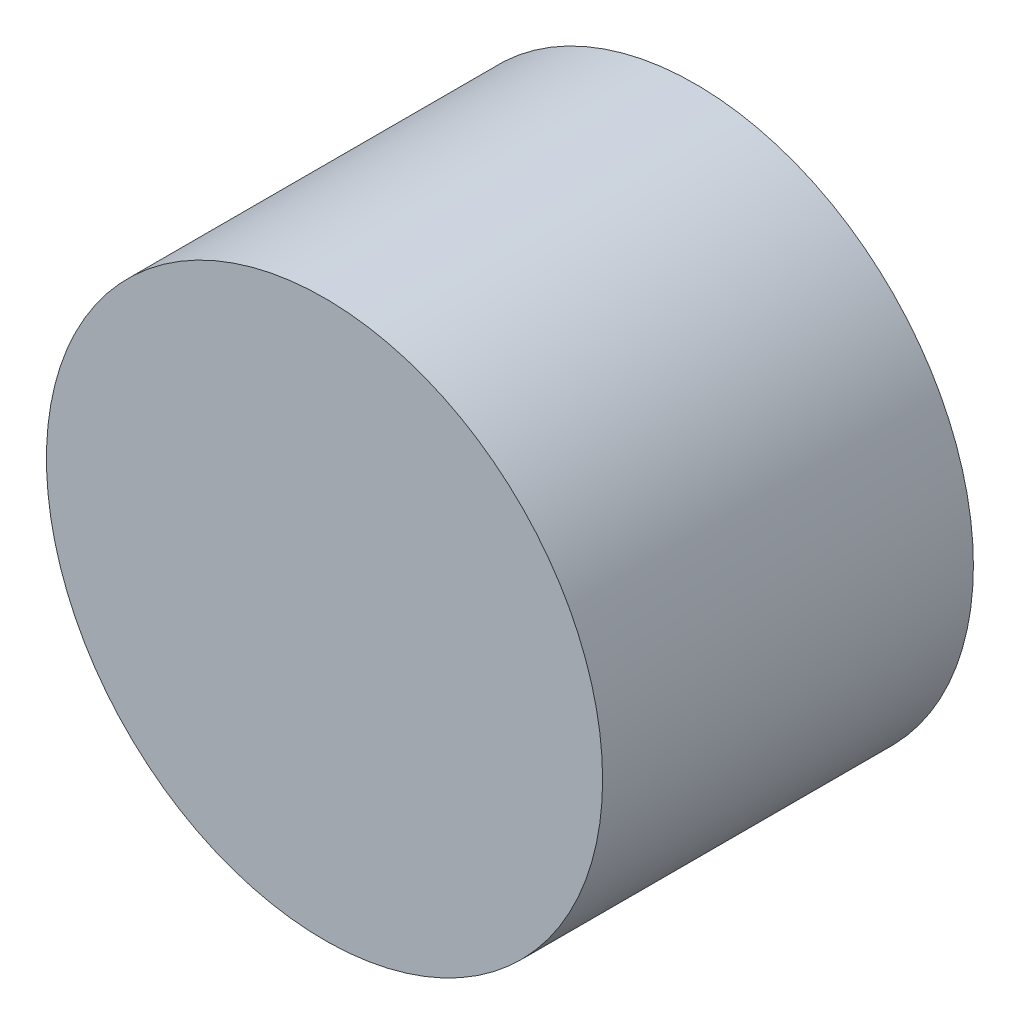
ISO-10303-21;
HEADER;
FILE_DESCRIPTION(('STEP AP214'),'2;1');
FILE_NAME('part.step','',(''),(''),'','','');
FILE_SCHEMA(('AUTOMOTIVE_DESIGN { 1 0 10303 214 1 1 1 1 }'));
ENDSEC;
DATA;
#1=APPLICATION_CONTEXT('core data for automotive mechanical design processes');
#2=APPLICATION_PROTOCOL_DEFINITION('international standard','automotive_design',2000,#1);
#3=PRODUCT_CONTEXT('',#1,'mechanical');
#4=PRODUCT('Part','Part','',(#3));
#5=PRODUCT_RELATED_PRODUCT_CATEGORY('part','',(#4));
#6=PRODUCT_DEFINITION_FORMATION('','',#4);
#7=PRODUCT_DEFINITION_CONTEXT('part definition',#1,'design');
#8=PRODUCT_DEFINITION('design','',#6,#7);
#9=PRODUCT_DEFINITION_SHAPE('','',#8);
#10=(LENGTH_UNIT() NAMED_UNIT(*) SI_UNIT(.MILLI.,.METRE.));
#11=(NAMED_UNIT(*) PLANE_ANGLE_UNIT() SI_UNIT($,.RADIAN.));
#12=(NAMED_UNIT(*) SI_UNIT($,.STERADIAN.) SOLID_ANGLE_UNIT());
#13=UNCERTAINTY_MEASURE_WITH_UNIT(LENGTH_MEASURE(1.E-05),#10,'distance_accuracy_value','');
#14=(GEOMETRIC_REPRESENTATION_CONTEXT(3) GLOBAL_UNCERTAINTY_ASSIGNED_CONTEXT((#13)) GLOBAL_UNIT_ASSIGNED_CONTEXT((#10,
#11,#12)) REPRESENTATION_CONTEXT('',''));
#15=CARTESIAN_POINT('',(0.,0.,0.));
#16=DIRECTION('',(0.,0.,1.));
#17=DIRECTION('',(1.,0.,0.));
#18=AXIS2_PLACEMENT_3D('',#15,#16,#17);
#19=CARTESIAN_POINT('',(0.,0.,16.));
#20=DIRECTION('',(0.,0.,-1.));
#21=DIRECTION('',(-1.,0.,0.));
#22=AXIS2_PLACEMENT_3D('',#19,#20,#21);
#23=CYLINDRICAL_SURFACE('',#22,12.);
#24=CARTESIAN_POINT('',(0.,0.,0.));
#25=DIRECTION('',(0.,0.,1.));
#26=DIRECTION('',(1.,0.,0.));
#27=AXIS2_PLACEMENT_3D('',#24,#25,#26);
#28=CIRCLE('',#27,12.);
#29=CARTESIAN_POINT('',(12.,0.,0.));
#30=VERTEX_POINT('',#29);
#31=EDGE_CURVE('E92',#30,#30,#28,.T.);
#32=ORIENTED_EDGE('',*,*,#31,.T.);
#33=EDGE_LOOP('',(#32));
#34=FACE_BOUND('',#33,.T.);
#35=CARTESIAN_POINT('',(0.,0.,16.));
#36=DIRECTION('',(0.,0.,1.));
#37=DIRECTION('',(1.,0.,0.));
#38=AXIS2_PLACEMENT_3D('',#35,#36,#37);
#39=CIRCLE('',#38,12.);
#40=CARTESIAN_POINT('',(12.,0.,16.));
#41=VERTEX_POINT('',#40);
#42=EDGE_CURVE('E121',#41,#41,#39,.T.);
#43=ORIENTED_EDGE('',*,*,#42,.F.);
#44=EDGE_LOOP('',(#43));
#45=FACE_BOUND('',#44,.T.);
#46=CARTESIAN_POINT('',(0.,0.,7.));
#47=DIRECTION('',(0.,0.,-1.));
#48=DIRECTION('',(-1.,0.,0.));
#49=AXIS2_PLACEMENT_3D('',#46,#47,#48);
#50=CIRCLE('',#49,12.);
#51=CARTESIAN_POINT('',(-10.3923048454133,-6.,7.));
#52=VERTEX_POINT('',#51);
#53=CARTESIAN_POINT('',(-10.3923048454133,6.,7.));
#54=VERTEX_POINT('',#53);
#55=EDGE_CURVE('E11',#52,#54,#50,.T.);
#56=ORIENTED_EDGE('',*,*,#55,.F.);
#57=DIRECTION('',(0.,0.,-1.));
#58=VECTOR('',#57,1.);
#59=CARTESIAN_POINT('',(-10.3923048454133,-6.,16.));
#60=LINE('',#59,#58);
#61=CARTESIAN_POINT('',(-10.3923048454133,-6.,1.));
#62=VERTEX_POINT('',#61);
#63=EDGE_CURVE('E125',#62,#52,#60,.F.);
#64=ORIENTED_EDGE('',*,*,#63,.F.);
#65=CARTESIAN_POINT('',(0.,0.,1.));
#66=DIRECTION('',(0.,0.,1.));
#67=DIRECTION('',(1.,0.,0.));
#68=AXIS2_PLACEMENT_3D('',#65,#66,#67);
#69=CIRCLE('',#68,12.);
#70=CARTESIAN_POINT('',(-10.3923048454133,6.,1.));
#71=VERTEX_POINT('',#70);
#72=EDGE_CURVE('E131',#71,#62,#69,.T.);
#73=ORIENTED_EDGE('',*,*,#72,.F.);
#74=DIRECTION('',(0.,0.,-1.));
#75=VECTOR('',#74,1.);
#76=CARTESIAN_POINT('',(-10.3923048454133,6.,16.));
#77=LINE('',#76,#75);
#78=EDGE_CURVE('E53',#54,#71,#77,.T.);
#79=ORIENTED_EDGE('',*,*,#78,.F.);
#80=EDGE_LOOP('',(#56,#64,#73,#79));
#81=FACE_BOUND('',#80,.T.);
#82=ADVANCED_FACE('F45',(#34,#45,#81),#23,.T.);
#83=CARTESIAN_POINT('',(0.,0.,16.));
#84=DIRECTION('',(0.,0.,1.));
#85=DIRECTION('',(1.,0.,0.));
#86=AXIS2_PLACEMENT_3D('',#83,#84,#85);
#87=PLANE('',#86);
#88=ORIENTED_EDGE('',*,*,#42,.T.);
#89=EDGE_LOOP('',(#88));
#90=FACE_BOUND('',#89,.T.);
#91=ADVANCED_FACE('F149',(#90),#87,.T.);
#92=CARTESIAN_POINT('',(0.,0.,0.));
#93=DIRECTION('',(0.,0.,1.));
#94=DIRECTION('',(1.,0.,0.));
#95=AXIS2_PLACEMENT_3D('',#92,#93,#94);
#96=PLANE('',#95);
#97=ORIENTED_EDGE('',*,*,#31,.F.);
#98=EDGE_LOOP('',(#97));
#99=FACE_BOUND('',#98,.T.);
#100=ADVANCED_FACE('F156',(#99),#96,.F.);
#101=CARTESIAN_POINT('',(-13.,-6.,7.));
#102=DIRECTION('',(0.,0.,-1.));
#103=DIRECTION('',(-1.,0.,0.));
#104=AXIS2_PLACEMENT_3D('',#101,#102,#103);
#105=PLANE('',#104);
#106=ORIENTED_EDGE('',*,*,#55,.T.);
#107=DIRECTION('',(1.,0.,0.));
#108=VECTOR('',#107,1.);
#109=CARTESIAN_POINT('',(-13.,6.,7.));
#110=LINE('',#109,#108);
#111=CARTESIAN_POINT('',(-3.00000000000001,6.,7.));
#112=VERTEX_POINT('',#111);
#113=EDGE_CURVE('E83',#54,#112,#110,.T.);
#114=ORIENTED_EDGE('',*,*,#113,.T.);
#115=DIRECTION('',(0.,1.,0.));
#116=VECTOR('',#115,1.);
#117=CARTESIAN_POINT('',(-3.00000000000001,-6.,7.));
#118=LINE('',#117,#116);
#119=CARTESIAN_POINT('',(-3.00000000000001,-6.,7.));
#120=VERTEX_POINT('',#119);
#121=EDGE_CURVE('E87',#120,#112,#118,.T.);
#122=ORIENTED_EDGE('',*,*,#121,.F.);
#123=DIRECTION('',(1.,0.,0.));
#124=VECTOR('',#123,1.);
#125=CARTESIAN_POINT('',(-13.,-6.,7.));
#126=LINE('',#125,#124);
#127=EDGE_CURVE('E114',#52,#120,#126,.T.);
#128=ORIENTED_EDGE('',*,*,#127,.F.);
#129=EDGE_LOOP('',(#106,#114,#122,#128));
#130=FACE_BOUND('',#129,.T.);
#131=ADVANCED_FACE('F85',(#130),#105,.T.);
#132=CARTESIAN_POINT('',(-13.,6.,1.));
#133=DIRECTION('',(0.,-1.,0.));
#134=DIRECTION('',(0.,0.,-1.));
#135=AXIS2_PLACEMENT_3D('',#132,#133,#134);
#136=PLANE('',#135);
#137=ORIENTED_EDGE('',*,*,#78,.T.);
#138=DIRECTION('',(1.,0.,0.));
#139=VECTOR('',#138,1.);
#140=CARTESIAN_POINT('',(-13.,6.,1.));
#141=LINE('',#140,#139);
#142=CARTESIAN_POINT('',(-3.00000000000001,6.,1.));
#143=VERTEX_POINT('',#142);
#144=EDGE_CURVE('E93',#71,#143,#141,.T.);
#145=ORIENTED_EDGE('',*,*,#144,.T.);
#146=DIRECTION('',(0.,0.,-1.));
#147=VECTOR('',#146,1.);
#148=CARTESIAN_POINT('',(-3.00000000000001,6.,1.));
#149=LINE('',#148,#147);
#150=EDGE_CURVE('E96',#112,#143,#149,.T.);
#151=ORIENTED_EDGE('',*,*,#150,.F.);
#152=ORIENTED_EDGE('',*,*,#113,.F.);
#153=EDGE_LOOP('',(#137,#145,#151,#152));
#154=FACE_BOUND('',#153,.T.);
#155=ADVANCED_FACE('F97',(#154),#136,.T.);
#156=CARTESIAN_POINT('',(-13.,-6.,1.));
#157=DIRECTION('',(0.,0.,1.));
#158=DIRECTION('',(1.,0.,0.));
#159=AXIS2_PLACEMENT_3D('',#156,#157,#158);
#160=PLANE('',#159);
#161=ORIENTED_EDGE('',*,*,#72,.T.);
#162=DIRECTION('',(1.,0.,0.));
#163=VECTOR('',#162,1.);
#164=CARTESIAN_POINT('',(-13.,-6.,1.));
#165=LINE('',#164,#163);
#166=CARTESIAN_POINT('',(-3.00000000000001,-6.,1.));
#167=VERTEX_POINT('',#166);
#168=EDGE_CURVE('E60',#62,#167,#165,.T.);
#169=ORIENTED_EDGE('',*,*,#168,.T.);
#170=DIRECTION('',(0.,-1.,0.));
#171=VECTOR('',#170,1.);
#172=CARTESIAN_POINT('',(-3.00000000000001,-6.,1.));
#173=LINE('',#172,#171);
#174=EDGE_CURVE('E103',#143,#167,#173,.T.);
#175=ORIENTED_EDGE('',*,*,#174,.F.);
#176=ORIENTED_EDGE('',*,*,#144,.F.);
#177=EDGE_LOOP('',(#161,#169,#175,#176));
#178=FACE_BOUND('',#177,.T.);
#179=ADVANCED_FACE('F137',(#178),#160,.T.);
#180=CARTESIAN_POINT('',(-13.,-6.,1.));
#181=DIRECTION('',(0.,1.,0.));
#182=DIRECTION('',(0.,0.,1.));
#183=AXIS2_PLACEMENT_3D('',#180,#181,#182);
#184=PLANE('',#183);
#185=ORIENTED_EDGE('',*,*,#63,.T.);
#186=ORIENTED_EDGE('',*,*,#127,.T.);
#187=DIRECTION('',(0.,0.,1.));
#188=VECTOR('',#187,1.);
#189=CARTESIAN_POINT('',(-3.00000000000001,-6.,1.));
#190=LINE('',#189,#188);
#191=EDGE_CURVE('E106',#167,#120,#190,.T.);
#192=ORIENTED_EDGE('',*,*,#191,.F.);
#193=ORIENTED_EDGE('',*,*,#168,.F.);
#194=EDGE_LOOP('',(#185,#186,#192,#193));
#195=FACE_BOUND('',#194,.T.);
#196=ADVANCED_FACE('F139',(#195),#184,.T.);
#197=CARTESIAN_POINT('',(-3.00000000000001,0.,0.));
#198=DIRECTION('',(1.,0.,0.));
#199=DIRECTION('',(0.,0.,-1.));
#200=AXIS2_PLACEMENT_3D('',#197,#198,#199);
#201=PLANE('',#200);
#202=ORIENTED_EDGE('',*,*,#121,.T.);
#203=ORIENTED_EDGE('',*,*,#150,.T.);
#204=ORIENTED_EDGE('',*,*,#174,.T.);
#205=ORIENTED_EDGE('',*,*,#191,.T.);
#206=EDGE_LOOP('',(#202,#203,#204,#205));
#207=FACE_BOUND('',#206,.T.);
#208=ADVANCED_FACE('F105',(#207),#201,.F.);
#209=CLOSED_SHELL('',(#82,#91,#100,#131,#155,#179,#196,#208));
#210=MANIFOLD_SOLID_BREP('B2',#209);
#211=ADVANCED_BREP_SHAPE_REPRESENTATION('',(#18,#210),#14);
#212=SHAPE_DEFINITION_REPRESENTATION(#9,#211);
ENDSEC;
END-ISO-10303-21;
